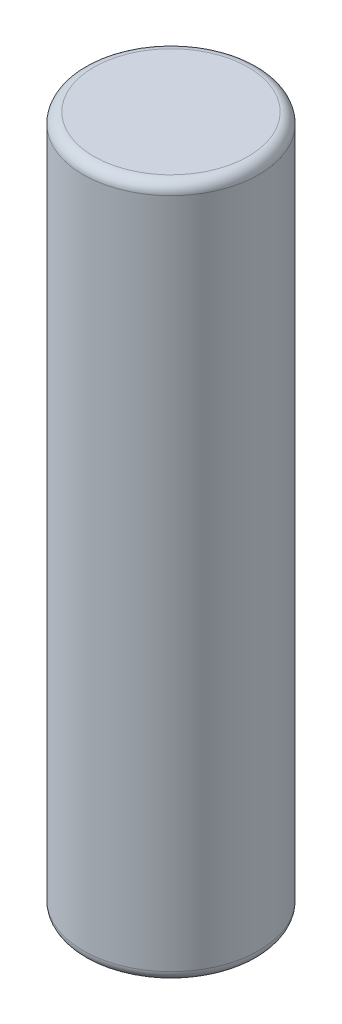
ISO-10303-21;
HEADER;
FILE_DESCRIPTION(('STEP AP214'),'2;1');
FILE_NAME('part.step','',(''),(''),'','','');
FILE_SCHEMA(('AUTOMOTIVE_DESIGN { 1 0 10303 214 1 1 1 1 }'));
ENDSEC;
DATA;
#1=APPLICATION_CONTEXT('core data for automotive mechanical design processes');
#2=APPLICATION_PROTOCOL_DEFINITION('international standard','automotive_design',2000,#1);
#3=PRODUCT_CONTEXT('',#1,'mechanical');
#4=PRODUCT('Part','Part','',(#3));
#5=PRODUCT_RELATED_PRODUCT_CATEGORY('part','',(#4));
#6=PRODUCT_DEFINITION_FORMATION('','',#4);
#7=PRODUCT_DEFINITION_CONTEXT('part definition',#1,'design');
#8=PRODUCT_DEFINITION('design','',#6,#7);
#9=PRODUCT_DEFINITION_SHAPE('','',#8);
#10=(LENGTH_UNIT() NAMED_UNIT(*) SI_UNIT(.MILLI.,.METRE.));
#11=(NAMED_UNIT(*) PLANE_ANGLE_UNIT() SI_UNIT($,.RADIAN.));
#12=(NAMED_UNIT(*) SI_UNIT($,.STERADIAN.) SOLID_ANGLE_UNIT());
#13=UNCERTAINTY_MEASURE_WITH_UNIT(LENGTH_MEASURE(1.E-05),#10,'distance_accuracy_value','');
#14=(GEOMETRIC_REPRESENTATION_CONTEXT(3) GLOBAL_UNCERTAINTY_ASSIGNED_CONTEXT((#13)) GLOBAL_UNIT_ASSIGNED_CONTEXT((#10,
#11,#12)) REPRESENTATION_CONTEXT('',''));
#15=CARTESIAN_POINT('',(0.,0.,0.));
#16=DIRECTION('',(0.,0.,1.));
#17=DIRECTION('',(1.,0.,0.));
#18=AXIS2_PLACEMENT_3D('',#15,#16,#17);
#19=CARTESIAN_POINT('',(0.,65.5,0.));
#20=DIRECTION('',(0.,-1.,0.));
#21=DIRECTION('',(0.,0.,-1.));
#22=AXIS2_PLACEMENT_3D('',#19,#20,#21);
#23=CYLINDRICAL_SURFACE('',#22,8.3);
#24=CARTESIAN_POINT('',(0.,1.,0.));
#25=DIRECTION('',(0.,1.,0.));
#26=DIRECTION('',(0.,0.,1.));
#27=AXIS2_PLACEMENT_3D('',#24,#25,#26);
#28=CIRCLE('',#27,8.3);
#29=CARTESIAN_POINT('',(0.,1.,8.3));
#30=VERTEX_POINT('',#29);
#31=EDGE_CURVE('E52',#30,#30,#28,.T.);
#32=ORIENTED_EDGE('',*,*,#31,.T.);
#33=EDGE_LOOP('',(#32));
#34=FACE_BOUND('',#33,.T.);
#35=CARTESIAN_POINT('',(0.,64.5,0.));
#36=DIRECTION('',(0.,1.,0.));
#37=DIRECTION('',(0.,0.,1.));
#38=AXIS2_PLACEMENT_3D('',#35,#36,#37);
#39=CIRCLE('',#38,8.3);
#40=CARTESIAN_POINT('',(0.,64.5,8.3));
#41=VERTEX_POINT('',#40);
#42=EDGE_CURVE('E56',#41,#41,#39,.F.);
#43=ORIENTED_EDGE('',*,*,#42,.T.);
#44=EDGE_LOOP('',(#43));
#45=FACE_BOUND('',#44,.T.);
#46=ADVANCED_FACE('F41',(#34,#45),#23,.T.);
#47=CARTESIAN_POINT('',(0.,65.5,0.));
#48=DIRECTION('',(0.,1.,0.));
#49=DIRECTION('',(0.,0.,1.));
#50=AXIS2_PLACEMENT_3D('',#47,#48,#49);
#51=PLANE('',#50);
#52=CARTESIAN_POINT('',(0.,65.5,0.));
#53=DIRECTION('',(0.,1.,0.));
#54=DIRECTION('',(0.,0.,1.));
#55=AXIS2_PLACEMENT_3D('',#52,#53,#54);
#56=CIRCLE('',#55,7.3);
#57=CARTESIAN_POINT('',(0.,65.5,7.3));
#58=VERTEX_POINT('',#57);
#59=EDGE_CURVE('E10',#58,#58,#56,.T.);
#60=ORIENTED_EDGE('',*,*,#59,.T.);
#61=EDGE_LOOP('',(#60));
#62=FACE_BOUND('',#61,.T.);
#63=ADVANCED_FACE('F72',(#62),#51,.T.);
#64=CARTESIAN_POINT('',(0.,0.,0.));
#65=DIRECTION('',(0.,1.,0.));
#66=DIRECTION('',(0.,0.,1.));
#67=AXIS2_PLACEMENT_3D('',#64,#65,#66);
#68=PLANE('',#67);
#69=CARTESIAN_POINT('',(0.,0.,0.));
#70=DIRECTION('',(0.,1.,0.));
#71=DIRECTION('',(0.,0.,1.));
#72=AXIS2_PLACEMENT_3D('',#69,#70,#71);
#73=CIRCLE('',#72,7.3);
#74=CARTESIAN_POINT('',(0.,0.,7.3));
#75=VERTEX_POINT('',#74);
#76=EDGE_CURVE('E48',#75,#75,#73,.F.);
#77=ORIENTED_EDGE('',*,*,#76,.T.);
#78=EDGE_LOOP('',(#77));
#79=FACE_BOUND('',#78,.T.);
#80=ADVANCED_FACE('F69',(#79),#68,.F.);
#81=CARTESIAN_POINT('',(0.,1.,0.));
#82=DIRECTION('',(0.,1.,0.));
#83=DIRECTION('',(0.,0.,1.));
#84=AXIS2_PLACEMENT_3D('',#81,#82,#83);
#85=TOROIDAL_SURFACE('',#84,7.3,1.);
#86=ORIENTED_EDGE('',*,*,#76,.F.);
#87=EDGE_LOOP('',(#86));
#88=FACE_BOUND('',#87,.T.);
#89=ORIENTED_EDGE('',*,*,#31,.F.);
#90=EDGE_LOOP('',(#89));
#91=FACE_BOUND('',#90,.T.);
#92=ADVANCED_FACE('F65',(#88,#91),#85,.T.);
#93=CARTESIAN_POINT('',(0.,64.5,0.));
#94=DIRECTION('',(0.,1.,0.));
#95=DIRECTION('',(0.,0.,1.));
#96=AXIS2_PLACEMENT_3D('',#93,#94,#95);
#97=TOROIDAL_SURFACE('',#96,7.3,1.);
#98=ORIENTED_EDGE('',*,*,#42,.F.);
#99=EDGE_LOOP('',(#98));
#100=FACE_BOUND('',#99,.T.);
#101=ORIENTED_EDGE('',*,*,#59,.F.);
#102=EDGE_LOOP('',(#101));
#103=FACE_BOUND('',#102,.T.);
#104=ADVANCED_FACE('F43',(#100,#103),#97,.T.);
#105=CLOSED_SHELL('',(#46,#63,#80,#92,#104));
#106=MANIFOLD_SOLID_BREP('B2',#105);
#107=ADVANCED_BREP_SHAPE_REPRESENTATION('',(#18,#106),#14);
#108=SHAPE_DEFINITION_REPRESENTATION(#9,#107);
ENDSEC;
END-ISO-10303-21;
